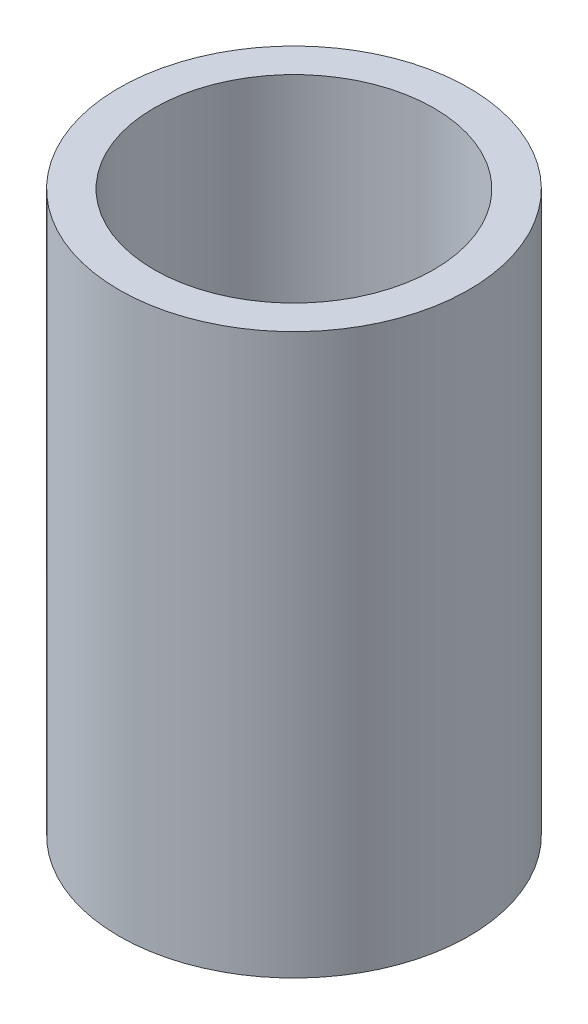
ISO-10303-21;
HEADER;
FILE_DESCRIPTION(('STEP AP214'),'2;1');
FILE_NAME('part.step','',(''),(''),'','','');
FILE_SCHEMA(('AUTOMOTIVE_DESIGN { 1 0 10303 214 1 1 1 1 }'));
ENDSEC;
DATA;
#1=APPLICATION_CONTEXT('core data for automotive mechanical design processes');
#2=APPLICATION_PROTOCOL_DEFINITION('international standard','automotive_design',2000,#1);
#3=PRODUCT_CONTEXT('',#1,'mechanical');
#4=PRODUCT('Part','Part','',(#3));
#5=PRODUCT_RELATED_PRODUCT_CATEGORY('part','',(#4));
#6=PRODUCT_DEFINITION_FORMATION('','',#4);
#7=PRODUCT_DEFINITION_CONTEXT('part definition',#1,'design');
#8=PRODUCT_DEFINITION('design','',#6,#7);
#9=PRODUCT_DEFINITION_SHAPE('','',#8);
#10=(LENGTH_UNIT() NAMED_UNIT(*) SI_UNIT(.MILLI.,.METRE.));
#11=(NAMED_UNIT(*) PLANE_ANGLE_UNIT() SI_UNIT($,.RADIAN.));
#12=(NAMED_UNIT(*) SI_UNIT($,.STERADIAN.) SOLID_ANGLE_UNIT());
#13=UNCERTAINTY_MEASURE_WITH_UNIT(LENGTH_MEASURE(1.E-05),#10,'distance_accuracy_value','');
#14=(GEOMETRIC_REPRESENTATION_CONTEXT(3) GLOBAL_UNCERTAINTY_ASSIGNED_CONTEXT((#13)) GLOBAL_UNIT_ASSIGNED_CONTEXT((#10,
#11,#12)) REPRESENTATION_CONTEXT('',''));
#15=CARTESIAN_POINT('',(0.,0.,0.));
#16=DIRECTION('',(0.,0.,1.));
#17=DIRECTION('',(1.,0.,0.));
#18=AXIS2_PLACEMENT_3D('',#15,#16,#17);
#19=CARTESIAN_POINT('',(0.,24.,0.));
#20=DIRECTION('',(0.,-1.,0.));
#21=DIRECTION('',(0.,0.,-1.));
#22=AXIS2_PLACEMENT_3D('',#19,#20,#21);
#23=CYLINDRICAL_SURFACE('',#22,7.5);
#24=CARTESIAN_POINT('',(0.,24.,0.));
#25=DIRECTION('',(0.,1.,0.));
#26=DIRECTION('',(0.,0.,1.));
#27=AXIS2_PLACEMENT_3D('',#24,#25,#26);
#28=CIRCLE('',#27,7.5);
#29=CARTESIAN_POINT('',(0.,24.,7.5));
#30=VERTEX_POINT('',#29);
#31=EDGE_CURVE('E10',#30,#30,#28,.T.);
#32=ORIENTED_EDGE('',*,*,#31,.F.);
#33=EDGE_LOOP('',(#32));
#34=FACE_BOUND('',#33,.T.);
#35=CARTESIAN_POINT('',(0.,0.,0.));
#36=DIRECTION('',(0.,1.,0.));
#37=DIRECTION('',(0.,0.,1.));
#38=AXIS2_PLACEMENT_3D('',#35,#36,#37);
#39=CIRCLE('',#38,7.5);
#40=CARTESIAN_POINT('',(0.,0.,7.5));
#41=VERTEX_POINT('',#40);
#42=EDGE_CURVE('E38',#41,#41,#39,.T.);
#43=ORIENTED_EDGE('',*,*,#42,.T.);
#44=EDGE_LOOP('',(#43));
#45=FACE_BOUND('',#44,.T.);
#46=ADVANCED_FACE('F35',(#34,#45),#23,.T.);
#47=CARTESIAN_POINT('',(0.,24.,0.));
#48=DIRECTION('',(0.,1.,0.));
#49=DIRECTION('',(0.,0.,1.));
#50=AXIS2_PLACEMENT_3D('',#47,#48,#49);
#51=PLANE('',#50);
#52=CARTESIAN_POINT('',(0.,24.,0.));
#53=DIRECTION('',(0.,1.,0.));
#54=DIRECTION('',(0.,0.,1.));
#55=AXIS2_PLACEMENT_3D('',#52,#53,#54);
#56=CIRCLE('',#55,6.);
#57=CARTESIAN_POINT('',(0.,24.,6.));
#58=VERTEX_POINT('',#57);
#59=EDGE_CURVE('E49',#58,#58,#56,.T.);
#60=ORIENTED_EDGE('',*,*,#59,.F.);
#61=EDGE_LOOP('',(#60));
#62=FACE_BOUND('',#61,.T.);
#63=ORIENTED_EDGE('',*,*,#31,.T.);
#64=EDGE_LOOP('',(#63));
#65=FACE_BOUND('',#64,.T.);
#66=ADVANCED_FACE('F56',(#62,#65),#51,.T.);
#67=CARTESIAN_POINT('',(0.,0.,0.));
#68=DIRECTION('',(0.,1.,0.));
#69=DIRECTION('',(0.,0.,1.));
#70=AXIS2_PLACEMENT_3D('',#67,#68,#69);
#71=PLANE('',#70);
#72=CARTESIAN_POINT('',(0.,0.,0.));
#73=DIRECTION('',(0.,1.,0.));
#74=DIRECTION('',(0.,0.,1.));
#75=AXIS2_PLACEMENT_3D('',#72,#73,#74);
#76=CIRCLE('',#75,6.);
#77=CARTESIAN_POINT('',(0.,0.,6.));
#78=VERTEX_POINT('',#77);
#79=EDGE_CURVE('E45',#78,#78,#76,.F.);
#80=ORIENTED_EDGE('',*,*,#79,.F.);
#81=EDGE_LOOP('',(#80));
#82=FACE_BOUND('',#81,.T.);
#83=ORIENTED_EDGE('',*,*,#42,.F.);
#84=EDGE_LOOP('',(#83));
#85=FACE_BOUND('',#84,.T.);
#86=ADVANCED_FACE('F58',(#82,#85),#71,.F.);
#87=CARTESIAN_POINT('',(0.,-0.001000000000001,0.));
#88=DIRECTION('',(0.,1.,0.));
#89=DIRECTION('',(0.,0.,1.));
#90=AXIS2_PLACEMENT_3D('',#87,#88,#89);
#91=CYLINDRICAL_SURFACE('',#90,6.);
#92=CARTESIAN_POINT('',(0.,24.,6.));
#93=CARTESIAN_POINT('',(0.,23.75,6.));
#94=CARTESIAN_POINT('',(0.,23.5,6.));
#95=CARTESIAN_POINT('',(0.,23.,6.));
#96=CARTESIAN_POINT('',(0.,22.75,6.));
#97=CARTESIAN_POINT('',(0.,22.25,6.));
#98=CARTESIAN_POINT('',(0.,22.,6.));
#99=CARTESIAN_POINT('',(0.,21.5,6.));
#100=CARTESIAN_POINT('',(0.,21.25,6.));
#101=CARTESIAN_POINT('',(0.,20.75,6.));
#102=CARTESIAN_POINT('',(0.,20.5,6.));
#103=CARTESIAN_POINT('',(0.,20.,6.));
#104=CARTESIAN_POINT('',(0.,19.75,6.));
#105=CARTESIAN_POINT('',(0.,19.25,6.));
#106=CARTESIAN_POINT('',(0.,19.,6.));
#107=CARTESIAN_POINT('',(0.,18.5,6.));
#108=CARTESIAN_POINT('',(0.,18.25,6.));
#109=CARTESIAN_POINT('',(0.,17.75,6.));
#110=CARTESIAN_POINT('',(0.,17.5,6.));
#111=CARTESIAN_POINT('',(0.,17.,6.));
#112=CARTESIAN_POINT('',(0.,16.75,6.));
#113=CARTESIAN_POINT('',(0.,16.25,6.));
#114=CARTESIAN_POINT('',(0.,16.,6.));
#115=CARTESIAN_POINT('',(0.,15.5,6.));
#116=CARTESIAN_POINT('',(0.,15.25,6.));
#117=CARTESIAN_POINT('',(0.,14.75,6.));
#118=CARTESIAN_POINT('',(0.,14.5,6.));
#119=CARTESIAN_POINT('',(0.,14.,6.));
#120=CARTESIAN_POINT('',(0.,13.75,6.));
#121=CARTESIAN_POINT('',(0.,13.25,6.));
#122=CARTESIAN_POINT('',(0.,13.,6.));
#123=CARTESIAN_POINT('',(0.,12.5,6.));
#124=CARTESIAN_POINT('',(0.,12.25,6.));
#125=CARTESIAN_POINT('',(0.,11.75,6.));
#126=CARTESIAN_POINT('',(0.,11.5,6.));
#127=CARTESIAN_POINT('',(0.,11.,6.));
#128=CARTESIAN_POINT('',(0.,10.75,6.));
#129=CARTESIAN_POINT('',(0.,10.25,6.));
#130=CARTESIAN_POINT('',(0.,10.,6.));
#131=CARTESIAN_POINT('',(0.,9.5,6.));
#132=CARTESIAN_POINT('',(0.,9.25,6.));
#133=CARTESIAN_POINT('',(0.,8.75,6.));
#134=CARTESIAN_POINT('',(0.,8.5,6.));
#135=CARTESIAN_POINT('',(0.,8.,6.));
#136=CARTESIAN_POINT('',(0.,7.75,6.));
#137=CARTESIAN_POINT('',(0.,7.25,6.));
#138=CARTESIAN_POINT('',(0.,7.,6.));
#139=CARTESIAN_POINT('',(0.,6.5,6.));
#140=CARTESIAN_POINT('',(0.,6.25,6.));
#141=CARTESIAN_POINT('',(0.,5.75,6.));
#142=CARTESIAN_POINT('',(0.,5.5,6.));
#143=CARTESIAN_POINT('',(0.,5.,6.));
#144=CARTESIAN_POINT('',(0.,4.75,6.));
#145=CARTESIAN_POINT('',(0.,4.25,6.));
#146=CARTESIAN_POINT('',(0.,4.,6.));
#147=CARTESIAN_POINT('',(0.,3.5,6.));
#148=CARTESIAN_POINT('',(0.,3.25,6.));
#149=CARTESIAN_POINT('',(0.,2.75,6.));
#150=CARTESIAN_POINT('',(0.,2.5,6.));
#151=CARTESIAN_POINT('',(0.,2.,6.));
#152=CARTESIAN_POINT('',(0.,1.75,6.));
#153=CARTESIAN_POINT('',(0.,1.25,6.));
#154=CARTESIAN_POINT('',(0.,1.,6.));
#155=CARTESIAN_POINT('',(0.,0.5,6.));
#156=CARTESIAN_POINT('',(0.,0.25,6.));
#157=CARTESIAN_POINT('',(0.,0.,6.));
#158=B_SPLINE_CURVE_WITH_KNOTS('',3,(#92,#93,#94,#95,#96,#97,#98,#99,#100,#101,#102,#103,#104,
#105,#106,#107,#108,#109,#110,#111,#112,#113,#114,#115,#116,#117,#118,#119,#120,#121,#122,#123,
#124,#125,#126,#127,#128,#129,#130,#131,#132,#133,#134,#135,#136,#137,#138,#139,#140,#141,#142,
#143,#144,#145,#146,#147,#148,#149,#150,#151,#152,#153,#154,#155,#156,#157),.UNSPECIFIED.,.F.,
.F.,(4,2,2,2,2,2,2,2,2,2,2,2,2,2,2,2,2,2,2,2,2,2,2,2,2,2,2,2,2,2,2,2,4),(0.,0.750000000000001,
1.5,2.25,3.,3.75,4.5,5.25,6.,6.75,7.5,8.25,9.,9.75,10.5,11.25,12.,12.75,13.5,14.25,15.,15.75,
16.5,17.25,18.,18.75,19.5,20.25,21.,21.75,22.5,23.25,24.),.UNSPECIFIED.);
#159=EDGE_CURVE('BSEAM53',#58,#78,#158,.T.);
#160=ORIENTED_EDGE('',*,*,#59,.T.);
#161=ORIENTED_EDGE('',*,*,#79,.T.);
#162=ORIENTED_EDGE('',*,*,#159,.T.);
#163=ORIENTED_EDGE('',*,*,#159,.F.);
#164=EDGE_LOOP('',(#160,#162,#161,#163));
#165=FACE_BOUND('',#164,.T.);
#166=ADVANCED_FACE('F53',(#165),#91,.F.);
#167=CLOSED_SHELL('',(#46,#66,#86,#166));
#168=MANIFOLD_SOLID_BREP('B2',#167);
#169=ADVANCED_BREP_SHAPE_REPRESENTATION('',(#18,#168),#14);
#170=SHAPE_DEFINITION_REPRESENTATION(#9,#169);
ENDSEC;
END-ISO-10303-21;
